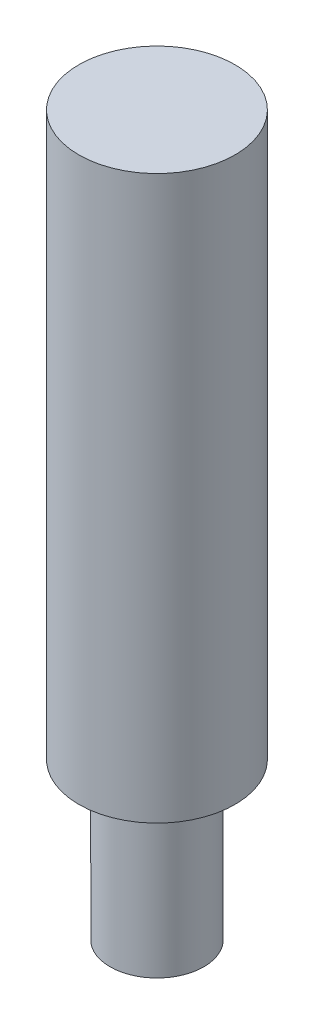
ISO-10303-21;
HEADER;
FILE_DESCRIPTION(('STEP AP214'),'2;1');
FILE_NAME('part.step','',(''),(''),'','','');
FILE_SCHEMA(('AUTOMOTIVE_DESIGN { 1 0 10303 214 1 1 1 1 }'));
ENDSEC;
DATA;
#1=APPLICATION_CONTEXT('core data for automotive mechanical design processes');
#2=APPLICATION_PROTOCOL_DEFINITION('international standard','automotive_design',2000,#1);
#3=PRODUCT_CONTEXT('',#1,'mechanical');
#4=PRODUCT('Part','Part','',(#3));
#5=PRODUCT_RELATED_PRODUCT_CATEGORY('part','',(#4));
#6=PRODUCT_DEFINITION_FORMATION('','',#4);
#7=PRODUCT_DEFINITION_CONTEXT('part definition',#1,'design');
#8=PRODUCT_DEFINITION('design','',#6,#7);
#9=PRODUCT_DEFINITION_SHAPE('','',#8);
#10=(LENGTH_UNIT() NAMED_UNIT(*) SI_UNIT(.MILLI.,.METRE.));
#11=(NAMED_UNIT(*) PLANE_ANGLE_UNIT() SI_UNIT($,.RADIAN.));
#12=(NAMED_UNIT(*) SI_UNIT($,.STERADIAN.) SOLID_ANGLE_UNIT());
#13=UNCERTAINTY_MEASURE_WITH_UNIT(LENGTH_MEASURE(1.E-05),#10,'distance_accuracy_value','');
#14=(GEOMETRIC_REPRESENTATION_CONTEXT(3) GLOBAL_UNCERTAINTY_ASSIGNED_CONTEXT((#13)) GLOBAL_UNIT_ASSIGNED_CONTEXT((#10,
#11,#12)) REPRESENTATION_CONTEXT('',''));
#15=CARTESIAN_POINT('',(0.,0.,0.));
#16=DIRECTION('',(0.,0.,1.));
#17=DIRECTION('',(1.,0.,0.));
#18=AXIS2_PLACEMENT_3D('',#15,#16,#17);
#19=CARTESIAN_POINT('',(0.,18.,0.));
#20=DIRECTION('',(0.,-1.,0.));
#21=DIRECTION('',(0.,0.,-1.));
#22=AXIS2_PLACEMENT_3D('',#19,#20,#21);
#23=CYLINDRICAL_SURFACE('',#22,2.5);
#24=CARTESIAN_POINT('',(0.,18.,0.));
#25=DIRECTION('',(0.,1.,0.));
#26=DIRECTION('',(0.,0.,1.));
#27=AXIS2_PLACEMENT_3D('',#24,#25,#26);
#28=CIRCLE('',#27,2.5);
#29=CARTESIAN_POINT('',(0.,18.,2.5));
#30=VERTEX_POINT('',#29);
#31=EDGE_CURVE('E36',#30,#30,#28,.T.);
#32=ORIENTED_EDGE('',*,*,#31,.F.);
#33=EDGE_LOOP('',(#32));
#34=FACE_BOUND('',#33,.T.);
#35=CARTESIAN_POINT('',(0.,0.,0.));
#36=DIRECTION('',(0.,1.,0.));
#37=DIRECTION('',(0.,0.,1.));
#38=AXIS2_PLACEMENT_3D('',#35,#36,#37);
#39=CIRCLE('',#38,2.5);
#40=CARTESIAN_POINT('',(0.,0.,2.5));
#41=VERTEX_POINT('',#40);
#42=EDGE_CURVE('E40',#41,#41,#39,.T.);
#43=ORIENTED_EDGE('',*,*,#42,.T.);
#44=EDGE_LOOP('',(#43));
#45=FACE_BOUND('',#44,.T.);
#46=ADVANCED_FACE('F30',(#34,#45),#23,.T.);
#47=CARTESIAN_POINT('',(0.,18.,0.));
#48=DIRECTION('',(0.,1.,0.));
#49=DIRECTION('',(0.,0.,1.));
#50=AXIS2_PLACEMENT_3D('',#47,#48,#49);
#51=PLANE('',#50);
#52=ORIENTED_EDGE('',*,*,#31,.T.);
#53=EDGE_LOOP('',(#52));
#54=FACE_BOUND('',#53,.T.);
#55=ADVANCED_FACE('F61',(#54),#51,.T.);
#56=CARTESIAN_POINT('',(0.,0.,0.));
#57=DIRECTION('',(0.,1.,0.));
#58=DIRECTION('',(0.,0.,1.));
#59=AXIS2_PLACEMENT_3D('',#56,#57,#58);
#60=PLANE('',#59);
#61=CARTESIAN_POINT('',(0.,0.,0.));
#62=DIRECTION('',(0.,1.,0.));
#63=DIRECTION('',(0.,0.,1.));
#64=AXIS2_PLACEMENT_3D('',#61,#62,#63);
#65=CIRCLE('',#64,1.5);
#66=CARTESIAN_POINT('',(0.,0.,1.5));
#67=VERTEX_POINT('',#66);
#68=EDGE_CURVE('E10',#67,#67,#65,.F.);
#69=ORIENTED_EDGE('',*,*,#68,.F.);
#70=EDGE_LOOP('',(#69));
#71=FACE_BOUND('',#70,.T.);
#72=ORIENTED_EDGE('',*,*,#42,.F.);
#73=EDGE_LOOP('',(#72));
#74=FACE_BOUND('',#73,.T.);
#75=ADVANCED_FACE('F54',(#71,#74),#60,.F.);
#76=CARTESIAN_POINT('',(0.,-5.,0.));
#77=DIRECTION('',(0.,1.,0.));
#78=DIRECTION('',(0.,0.,1.));
#79=AXIS2_PLACEMENT_3D('',#76,#77,#78);
#80=CYLINDRICAL_SURFACE('',#79,1.5);
#81=CARTESIAN_POINT('',(0.,-5.,0.));
#82=DIRECTION('',(0.,-1.,0.));
#83=DIRECTION('',(0.,0.,-1.));
#84=AXIS2_PLACEMENT_3D('',#81,#82,#83);
#85=CIRCLE('',#84,1.5);
#86=CARTESIAN_POINT('',(0.,-5.,-1.5));
#87=VERTEX_POINT('',#86);
#88=EDGE_CURVE('E45',#87,#87,#85,.T.);
#89=ORIENTED_EDGE('',*,*,#88,.F.);
#90=EDGE_LOOP('',(#89));
#91=FACE_BOUND('',#90,.T.);
#92=ORIENTED_EDGE('',*,*,#68,.T.);
#93=EDGE_LOOP('',(#92));
#94=FACE_BOUND('',#93,.T.);
#95=ADVANCED_FACE('F52',(#91,#94),#80,.T.);
#96=CARTESIAN_POINT('',(0.,-5.,0.));
#97=DIRECTION('',(0.,-1.,0.));
#98=DIRECTION('',(0.,0.,-1.));
#99=AXIS2_PLACEMENT_3D('',#96,#97,#98);
#100=PLANE('',#99);
#101=ORIENTED_EDGE('',*,*,#88,.T.);
#102=EDGE_LOOP('',(#101));
#103=FACE_BOUND('',#102,.T.);
#104=ADVANCED_FACE('F50',(#103),#100,.T.);
#105=CLOSED_SHELL('',(#46,#55,#75,#95,#104));
#106=MANIFOLD_SOLID_BREP('B2',#105);
#107=ADVANCED_BREP_SHAPE_REPRESENTATION('',(#18,#106),#14);
#108=SHAPE_DEFINITION_REPRESENTATION(#9,#107);
ENDSEC;
END-ISO-10303-21;
